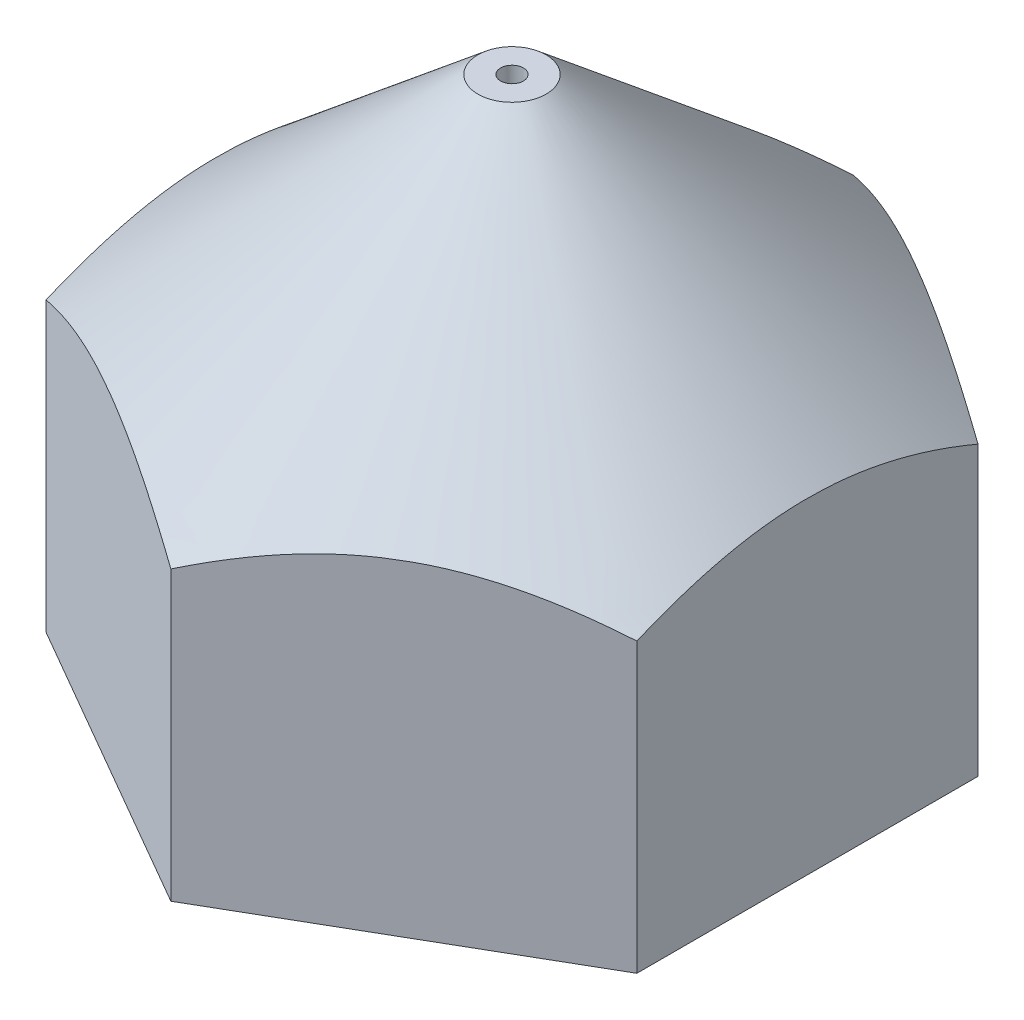
ISO-10303-21;
HEADER;
FILE_DESCRIPTION(('STEP AP214'),'2;1');
FILE_NAME('part.step','',(''),(''),'','','');
FILE_SCHEMA(('AUTOMOTIVE_DESIGN { 1 0 10303 214 1 1 1 1 }'));
ENDSEC;
DATA;
#1=APPLICATION_CONTEXT('core data for automotive mechanical design processes');
#2=APPLICATION_PROTOCOL_DEFINITION('international standard','automotive_design',2000,#1);
#3=PRODUCT_CONTEXT('',#1,'mechanical');
#4=PRODUCT('Part','Part','',(#3));
#5=PRODUCT_RELATED_PRODUCT_CATEGORY('part','',(#4));
#6=PRODUCT_DEFINITION_FORMATION('','',#4);
#7=PRODUCT_DEFINITION_CONTEXT('part definition',#1,'design');
#8=PRODUCT_DEFINITION('design','',#6,#7);
#9=PRODUCT_DEFINITION_SHAPE('','',#8);
#10=(LENGTH_UNIT() NAMED_UNIT(*) SI_UNIT(.MILLI.,.METRE.));
#11=(NAMED_UNIT(*) PLANE_ANGLE_UNIT() SI_UNIT($,.RADIAN.));
#12=(NAMED_UNIT(*) SI_UNIT($,.STERADIAN.) SOLID_ANGLE_UNIT());
#13=UNCERTAINTY_MEASURE_WITH_UNIT(LENGTH_MEASURE(1.E-05),#10,'distance_accuracy_value','');
#14=(GEOMETRIC_REPRESENTATION_CONTEXT(3) GLOBAL_UNCERTAINTY_ASSIGNED_CONTEXT((#13)) GLOBAL_UNIT_ASSIGNED_CONTEXT((#10,
#11,#12)) REPRESENTATION_CONTEXT('',''));
#15=CARTESIAN_POINT('',(0.,0.,0.));
#16=DIRECTION('',(0.,0.,1.));
#17=DIRECTION('',(1.,0.,0.));
#18=AXIS2_PLACEMENT_3D('',#15,#16,#17);
#19=CARTESIAN_POINT('',(6.5,6.,-3.75277674973256));
#20=DIRECTION('',(-0.5,0.,0.866025403784439));
#21=DIRECTION('',(0.866025403784439,0.,0.5));
#22=AXIS2_PLACEMENT_3D('',#19,#20,#21);
#23=PLANE('',#22);
#24=CARTESIAN_POINT('',(6.5002,0.331320657084994,-3.75266127967872));
#25=CARTESIAN_POINT('',(6.28140630257821,0.437269293634635,-3.87898187978218));
#26=CARTESIAN_POINT('',(6.05994197784242,0.536592667607084,-4.00684436728429));
#27=CARTESIAN_POINT('',(5.61105832624123,0.718170563291601,-4.26600746437106));
#28=CARTESIAN_POINT('',(5.38362202146858,0.80036870577893,-4.39731787615504));
#29=CARTESIAN_POINT('',(4.92570762681306,0.942483332184133,-4.66169487517521));
#30=CARTESIAN_POINT('',(4.69527648431638,1.00259702340346,-4.79473435732534));
#31=CARTESIAN_POINT('',(4.2306817676331,1.09738288374467,-5.06296824206651));
#32=CARTESIAN_POINT('',(3.99652310689733,1.13208610162755,-5.19815980787539));
#33=CARTESIAN_POINT('',(3.64193021282832,1.16319795318809,-5.40288411071886));
#34=CARTESIAN_POINT('',(3.52213444765227,1.17004388074785,-5.47204822799103));
#35=CARTESIAN_POINT('',(3.28239122125211,1.17632059579379,-5.61046404428955));
#36=CARTESIAN_POINT('',(3.16244376526932,1.17575163284341,-5.67971574028982));
#37=CARTESIAN_POINT('',(2.92270451447486,1.16719944495742,-5.81812926127133));
#38=CARTESIAN_POINT('',(2.80291279409784,1.15921346411761,-5.88729104327769));
#39=CARTESIAN_POINT('',(2.56384865114642,1.13601868558657,-6.02531479056428));
#40=CARTESIAN_POINT('',(2.4445763036696,1.12080887623102,-6.0941767124869));
#41=CARTESIAN_POINT('',(2.08804197595749,1.06482059665183,-6.30002190256683));
#42=CARTESIAN_POINT('',(1.85196432749452,1.01367932307555,-6.43632139645658));
#43=CARTESIAN_POINT('',(1.38463502573208,0.887648543757464,-6.70613409462932));
#44=CARTESIAN_POINT('',(1.15338547201889,0.812748926447817,-6.83964608671561));
#45=CARTESIAN_POINT('',(0.846386000512093,0.699191564132035,-7.01689231423114));
#46=CARTESIAN_POINT('',(0.768202793522457,0.669016087152231,-7.06203140983271));
#47=CARTESIAN_POINT('',(0.612499676954843,0.606569571062283,-7.15192664609669));
#48=CARTESIAN_POINT('',(0.534979497844023,0.574299434250425,-7.19668294237395));
#49=CARTESIAN_POINT('',(0.38084286951738,0.507936293775513,-7.28567376623031));
#50=CARTESIAN_POINT('',(0.304224188368004,0.473850171695339,-7.32990958241686));
#51=CARTESIAN_POINT('',(0.151570786739018,0.403888173770374,-7.41804406494007));
#52=CARTESIAN_POINT('',(0.0755362790006215,0.36801167854291,-7.46194260845053));
#53=CARTESIAN_POINT('',(-0.000200000000013523,0.331320657084993,-7.50566896951897));
#54=B_SPLINE_CURVE_WITH_KNOTS('',3,(#24,#25,#26,#27,#28,#29,#30,#31,#32,#33,#34,#35,#36,#37,#38,
#39,#40,#41,#42,#43,#44,#45,#46,#47,#48,#49,#50,#51,#52,#53),.UNSPECIFIED.,.F.,.F.,(4,2,2,2,2,2,
2,2,2,2,2,2,2,2,4),(0.,0.822205969643293,1.64707744103592,2.46439292325695,3.2807080630647,
3.69603022493232,4.11133840831134,4.52680096743511,4.94232172736445,5.77302387353115,
6.60408004255696,6.88962944321399,7.17505664622203,7.45947006506786,7.74398256870483),.UNSPECIFIED.);
#55=CARTESIAN_POINT('',(6.5,0.331417550200489,-3.75277674973256));
#56=VERTEX_POINT('',#55);
#57=CARTESIAN_POINT('',(0.,0.331417550200489,-7.50555349946513));
#58=VERTEX_POINT('',#57);
#59=EDGE_CURVE('E85',#56,#58,#54,.T.);
#60=ORIENTED_EDGE('',*,*,#59,.F.);
#61=DIRECTION('',(0.,-1.,0.));
#62=VECTOR('',#61,1.);
#63=CARTESIAN_POINT('',(6.5,6.,-3.75277674973256));
#64=LINE('',#63,#62);
#65=CARTESIAN_POINT('',(6.5,-6.,-3.75277674973256));
#66=VERTEX_POINT('',#65);
#67=EDGE_CURVE('E57',#56,#66,#64,.T.);
#68=ORIENTED_EDGE('',*,*,#67,.T.);
#69=DIRECTION('',(-0.866025403784439,0.,-0.5));
#70=VECTOR('',#69,1.);
#71=CARTESIAN_POINT('',(6.5,-6.,-3.75277674973256));
#72=LINE('',#71,#70);
#73=CARTESIAN_POINT('',(0.,-6.,-7.50555349946513));
#74=VERTEX_POINT('',#73);
#75=EDGE_CURVE('E92',#66,#74,#72,.T.);
#76=ORIENTED_EDGE('',*,*,#75,.T.);
#77=DIRECTION('',(0.,-1.,0.));
#78=VECTOR('',#77,1.);
#79=CARTESIAN_POINT('',(0.,6.,-7.50555349946513));
#80=LINE('',#79,#78);
#81=EDGE_CURVE('E11',#58,#74,#80,.T.);
#82=ORIENTED_EDGE('',*,*,#81,.F.);
#83=EDGE_LOOP('',(#60,#68,#76,#82));
#84=FACE_BOUND('',#83,.T.);
#85=ADVANCED_FACE('F33',(#84),#23,.F.);
#86=CARTESIAN_POINT('',(0.,6.,-7.50555349946513));
#87=DIRECTION('',(0.5,0.,0.866025403784438));
#88=DIRECTION('',(0.866025403784439,0.,-0.5));
#89=AXIS2_PLACEMENT_3D('',#86,#87,#88);
#90=PLANE('',#89);
#91=CARTESIAN_POINT('',(0.000199999999986277,0.331320657084993,-7.50566896951897));
#92=CARTESIAN_POINT('',(-0.218593697421802,0.437269293634631,-7.37934836941551));
#93=CARTESIAN_POINT('',(-0.440058022157595,0.53659266760708,-7.2514858819134));
#94=CARTESIAN_POINT('',(-0.888941673758778,0.718170563291597,-6.99232278482663));
#95=CARTESIAN_POINT('',(-1.11637797853143,0.800368705778926,-6.86101237304265));
#96=CARTESIAN_POINT('',(-1.57429237318695,0.942483332184127,-6.59663537402248));
#97=CARTESIAN_POINT('',(-1.80472351568364,1.00259702340345,-6.46359589187234));
#98=CARTESIAN_POINT('',(-2.26931823236691,1.09738288374466,-6.19536200713118));
#99=CARTESIAN_POINT('',(-2.50347689310268,1.13208610162755,-6.0601704413223));
#100=CARTESIAN_POINT('',(-2.85806978717169,1.16319795318808,-5.85544613847882));
#101=CARTESIAN_POINT('',(-2.97786555234774,1.17004388074784,-5.78628202120666));
#102=CARTESIAN_POINT('',(-3.2176087787479,1.17632059579378,-5.64786620490813));
#103=CARTESIAN_POINT('',(-3.33755623473069,1.1757516328434,-5.57861450890786));
#104=CARTESIAN_POINT('',(-3.57729548552515,1.16719944495741,-5.44020098792636));
#105=CARTESIAN_POINT('',(-3.69708720590217,1.1592134641176,-5.37103920592));
#106=CARTESIAN_POINT('',(-3.93615134885359,1.13601868558656,-5.23301545863341));
#107=CARTESIAN_POINT('',(-4.05542369633041,1.12080887623101,-5.16415353671079));
#108=CARTESIAN_POINT('',(-4.41195802404252,1.06482059665182,-4.95830834663086));
#109=CARTESIAN_POINT('',(-4.64803567250549,1.01367932307554,-4.82200885274111));
#110=CARTESIAN_POINT('',(-5.11536497426793,0.88764854375745,-4.55219615456837));
#111=CARTESIAN_POINT('',(-5.34661452798112,0.812748926447803,-4.41868416248207));
#112=CARTESIAN_POINT('',(-5.65361399948791,0.699191564132021,-4.24143793496655));
#113=CARTESIAN_POINT('',(-5.73179720647755,0.669016087152217,-4.19629883936498));
#114=CARTESIAN_POINT('',(-5.88750032304516,0.606569571062269,-4.10640360310101));
#115=CARTESIAN_POINT('',(-5.96502050215598,0.574299434250412,-4.06164730682375));
#116=CARTESIAN_POINT('',(-6.11915713048262,0.507936293775501,-3.97265648296738));
#117=CARTESIAN_POINT('',(-6.19577581163199,0.473850171695329,-3.92842066678083));
#118=CARTESIAN_POINT('',(-6.34842921326098,0.403888173770366,-3.84028618425763));
#119=CARTESIAN_POINT('',(-6.42446372099937,0.368011678542903,-3.79638764074716));
#120=CARTESIAN_POINT('',(-6.50020000000001,0.331320657084985,-3.75266127967873));
#121=B_SPLINE_CURVE_WITH_KNOTS('',3,(#91,#92,#93,#94,#95,#96,#97,#98,#99,#100,#101,#102,#103,
#104,#105,#106,#107,#108,#109,#110,#111,#112,#113,#114,#115,#116,#117,#118,#119,#120),
.UNSPECIFIED.,.F.,.F.,(4,2,2,2,2,2,2,2,2,2,2,2,2,2,4),(0.,0.822205969643292,1.64707744103592,
2.46439292325695,3.28070806306469,3.69603022493232,4.11133840831134,4.5268009674351,
4.94232172736445,5.77302387353114,6.60408004255695,6.88962944321398,7.17505664622202,
7.45947006506784,7.7439825687048),.UNSPECIFIED.);
#122=CARTESIAN_POINT('',(-6.50000000000001,0.331417550200489,-3.75277674973255));
#123=VERTEX_POINT('',#122);
#124=EDGE_CURVE('E88',#58,#123,#121,.T.);
#125=ORIENTED_EDGE('',*,*,#124,.F.);
#126=ORIENTED_EDGE('',*,*,#81,.T.);
#127=DIRECTION('',(-0.866025403784439,0.,0.5));
#128=VECTOR('',#127,1.);
#129=CARTESIAN_POINT('',(0.,-6.,-7.50555349946513));
#130=LINE('',#129,#128);
#131=CARTESIAN_POINT('',(-6.50000000000001,-6.,-3.75277674973257));
#132=VERTEX_POINT('',#131);
#133=EDGE_CURVE('E104',#74,#132,#130,.T.);
#134=ORIENTED_EDGE('',*,*,#133,.T.);
#135=DIRECTION('',(0.,-1.,0.));
#136=VECTOR('',#135,1.);
#137=CARTESIAN_POINT('',(-6.50000000000001,6.,-3.75277674973257));
#138=LINE('',#137,#136);
#139=EDGE_CURVE('E42',#123,#132,#138,.T.);
#140=ORIENTED_EDGE('',*,*,#139,.F.);
#141=EDGE_LOOP('',(#125,#126,#134,#140));
#142=FACE_BOUND('',#141,.T.);
#143=ADVANCED_FACE('F96',(#142),#90,.F.);
#144=CARTESIAN_POINT('',(-6.50000000000001,6.,-3.75277674973257));
#145=DIRECTION('',(1.,0.,0.));
#146=DIRECTION('',(0.,0.,-1.));
#147=AXIS2_PLACEMENT_3D('',#144,#145,#146);
#148=PLANE('',#147);
#149=CARTESIAN_POINT('',(-6.50000000000001,-1.8205134221234,-7.69138588590504));
#150=CARTESIAN_POINT('',(-6.50000000000001,-1.69267285383202,-7.4918635660892));
#151=CARTESIAN_POINT('',(-6.50000000000001,-1.56625170732981,-7.29141557931619));
#152=CARTESIAN_POINT('',(-6.50000000000001,-1.31690183415457,-6.88829380828733));
#153=CARTESIAN_POINT('',(-6.50000000000001,-1.19397396916951,-6.68561949166684));
#154=CARTESIAN_POINT('',(-6.50000000000001,-0.951481787846135,-6.27634058525399));
#155=CARTESIAN_POINT('',(-6.50000000000001,-0.831947034972371,-6.06971841563172));
#156=CARTESIAN_POINT('',(-6.50000000000001,-0.598085532332962,-5.65355598224154));
#157=CARTESIAN_POINT('',(-6.50000000000001,-0.483758440590684,-5.44401591126967));
#158=CARTESIAN_POINT('',(-6.50000000000001,-0.256870766720181,-5.01282778933708));
#159=CARTESIAN_POINT('',(-6.50000000000001,-0.144579048966412,-4.79103750814606));
#160=CARTESIAN_POINT('',(-6.50000000000001,0.0714325230356011,-4.34326047255116));
#161=CARTESIAN_POINT('',(-6.50000000000001,0.17515130857109,-4.11727319923241));
#162=CARTESIAN_POINT('',(-6.50000000000001,0.371612050774019,-3.66124907627616));
#163=CARTESIAN_POINT('',(-6.50000000000001,0.464382451624991,-3.4312245872774));
#164=CARTESIAN_POINT('',(-6.50000000000001,0.636635056349476,-2.96629585979503));
#165=CARTESIAN_POINT('',(-6.50000000000001,0.716122121971748,-2.73139344219722));
#166=CARTESIAN_POINT('',(-6.50000000000001,0.860602056421721,-2.25072007871624));
#167=CARTESIAN_POINT('',(-6.50000000000001,0.925185421865042,-2.00482411785347));
#168=CARTESIAN_POINT('',(-6.50000000000001,1.03383593332416,-1.50846279340484));
#169=CARTESIAN_POINT('',(-6.50000000000001,1.07790368711325,-1.25799756541159));
#170=CARTESIAN_POINT('',(-6.50000000000001,1.14206167266906,-0.758023565227422));
#171=CARTESIAN_POINT('',(-6.5,1.16252387085642,-0.508563486131926));
#172=CARTESIAN_POINT('',(-6.5,1.17919471237858,-0.008821201167555));
#173=CARTESIAN_POINT('',(-6.5,1.17540432430372,0.241460971469861));
#174=CARTESIAN_POINT('',(-6.5,1.14469324954603,0.727548391153283));
#175=CARTESIAN_POINT('',(-6.5,1.11898010903919,0.963432352274643));
#176=CARTESIAN_POINT('',(-6.5,1.04771231994224,1.4321424315775));
#177=CARTESIAN_POINT('',(-6.5,1.00215633129042,1.66496834214326));
#178=CARTESIAN_POINT('',(-6.5,0.892685351614614,2.13095616527684));
#179=CARTESIAN_POINT('',(-6.5,0.828433245774249,2.36403796486644));
#180=CARTESIAN_POINT('',(-6.5,0.720794850219654,2.7100496817943));
#181=CARTESIAN_POINT('',(-6.5,0.683041092092518,2.82477880887899));
#182=CARTESIAN_POINT('',(-6.5,0.604125819792421,3.05305451329707));
#183=CARTESIAN_POINT('',(-6.5,0.562964467706642,3.16660114658861));
#184=CARTESIAN_POINT('',(-6.5,0.429463084297135,3.51980778040222));
#185=CARTESIAN_POINT('',(-6.5,0.331708654713934,3.75742940032637));
#186=CARTESIAN_POINT('',(-6.5,0.125116472829273,4.22783563111045));
#187=CARTESIAN_POINT('',(-6.5,0.0162749338331895,4.46061855645636));
#188=CARTESIAN_POINT('',(-6.5,-0.210360055092992,4.92213574478891));
#189=CARTESIAN_POINT('',(-6.5,-0.328164896597481,5.15086438436369));
#190=CARTESIAN_POINT('',(-6.5,-0.57081232338037,5.60450470237713));
#191=CARTESIAN_POINT('',(-6.5,-0.695654144537144,5.82941679180452));
#192=CARTESIAN_POINT('',(-6.5,-0.951843294385344,6.27743377274258));
#193=CARTESIAN_POINT('',(-6.5,-1.08322761683254,6.50051743186055));
#194=CARTESIAN_POINT('',(-6.5,-1.35066480713304,6.94386639788338));
#195=CARTESIAN_POINT('',(-6.5,-1.48671777675766,7.16413164320608));
#196=CARTESIAN_POINT('',(-6.5,-1.76255136188309,7.60209798967929));
#197=CARTESIAN_POINT('',(-6.5,-1.90232934173769,7.81980075452581));
#198=CARTESIAN_POINT('',(-6.5,-2.18505033133048,8.25314370553777));
#199=CARTESIAN_POINT('',(-6.5,-2.32799341114257,8.46878384588596));
#200=CARTESIAN_POINT('',(-6.5,-2.72919393759764,9.06604671736743));
#201=CARTESIAN_POINT('',(-6.5,-2.99030930811035,9.44574937412035));
#202=CARTESIAN_POINT('',(-6.5,-3.51874619695136,10.2008880125813));
#203=CARTESIAN_POINT('',(-6.5,-3.78606877854178,10.5763232466504));
#204=CARTESIAN_POINT('',(-6.5,-4.32172347788932,11.3186888251343));
#205=CARTESIAN_POINT('',(-6.5,-4.58999180169642,11.6856652658984));
#206=CARTESIAN_POINT('',(-6.5,-4.9950302402494,12.234102444834));
#207=CARTESIAN_POINT('',(-6.5,-5.13046422929158,12.4165528442246));
#208=CARTESIAN_POINT('',(-6.5,-5.40212825443721,12.7808579337193));
#209=CARTESIAN_POINT('',(-6.5,-5.53835828436392,12.9627126284286));
#210=CARTESIAN_POINT('',(-6.5,-5.67494034862188,13.1443026829529));
#211=B_SPLINE_CURVE_WITH_KNOTS('',3,(#149,#150,#151,#152,#153,#154,#155,#156,#157,#158,#159,
#160,#161,#162,#163,#164,#165,#166,#167,#168,#169,#170,#171,#172,#173,#174,#175,#176,#177,#178,
#179,#180,#181,#182,#183,#184,#185,#186,#187,#188,#189,#190,#191,#192,#193,#194,#195,#196,#197,
#198,#199,#200,#201,#202,#203,#204,#205,#206,#207,#208,#209,#210),.UNSPECIFIED.,.F.,.F.,(4,2,2,
2,2,2,2,2,2,2,2,2,2,2,2,2,2,2,2,2,2,2,2,2,2,2,2,2,2,2,4),(0.,0.710908967485046,1.42199179898245,
2.13805153321099,2.85406417724668,3.59970564286236,4.34543992134921,5.08919199936263,
5.8326712623828,6.59463555955354,7.35657728215844,8.10634119166055,8.85607515757102,
9.56699756745079,10.2779679960238,11.0026496708526,11.3649502040463,11.7272335137771,
12.4976685061028,13.2683675209426,14.0400629358473,14.8116747158021,15.5882992107329,
16.3649406459816,17.1410464375138,17.9171694288972,19.2995371451536,20.682143426401,
22.0458429461921,22.7275117913519,23.4091753542183),.UNSPECIFIED.);
#212=CARTESIAN_POINT('',(-6.49999999999998,0.331417550200489,3.75277674973259));
#213=VERTEX_POINT('',#212);
#214=EDGE_CURVE('E99',#123,#213,#211,.T.);
#215=ORIENTED_EDGE('',*,*,#214,.F.);
#216=ORIENTED_EDGE('',*,*,#139,.T.);
#217=DIRECTION('',(0.,0.,1.));
#218=VECTOR('',#217,1.);
#219=CARTESIAN_POINT('',(-6.50000000000001,-6.,-3.75277674973257));
#220=LINE('',#219,#218);
#221=CARTESIAN_POINT('',(-6.5,-6.,3.75277674973258));
#222=VERTEX_POINT('',#221);
#223=EDGE_CURVE('E106',#132,#222,#220,.T.);
#224=ORIENTED_EDGE('',*,*,#223,.T.);
#225=DIRECTION('',(0.,-1.,0.));
#226=VECTOR('',#225,1.);
#227=CARTESIAN_POINT('',(-6.5,6.,3.75277674973258));
#228=LINE('',#227,#226);
#229=EDGE_CURVE('E128',#213,#222,#228,.T.);
#230=ORIENTED_EDGE('',*,*,#229,.F.);
#231=EDGE_LOOP('',(#215,#216,#224,#230));
#232=FACE_BOUND('',#231,.T.);
#233=ADVANCED_FACE('F131',(#232),#148,.F.);
#234=CARTESIAN_POINT('',(-6.5,6.,3.75277674973258));
#235=DIRECTION('',(0.5,0.,-0.866025403784439));
#236=DIRECTION('',(-0.866025403784439,0.,-0.5));
#237=AXIS2_PLACEMENT_3D('',#234,#235,#236);
#238=PLANE('',#237);
#239=CARTESIAN_POINT('',(-6.5002,0.331320657084984,3.75266127967874));
#240=CARTESIAN_POINT('',(-6.28140630257821,0.437269293634623,3.8789818797822));
#241=CARTESIAN_POINT('',(-6.05994197784242,0.536592667607072,4.00684436728431));
#242=CARTESIAN_POINT('',(-5.61105832624124,0.718170563291589,4.26600746437108));
#243=CARTESIAN_POINT('',(-5.38362202146859,0.800368705778918,4.39731787615506));
#244=CARTESIAN_POINT('',(-4.92570762681306,0.94248333218412,4.66169487517523));
#245=CARTESIAN_POINT('',(-4.69527648431638,1.00259702340345,4.79473435732536));
#246=CARTESIAN_POINT('',(-4.2306817676331,1.09738288374466,5.06296824206653));
#247=CARTESIAN_POINT('',(-3.99652310689733,1.13208610162754,5.19815980787541));
#248=CARTESIAN_POINT('',(-3.64193021282832,1.16319795318807,5.40288411071888));
#249=CARTESIAN_POINT('',(-3.52213444765227,1.17004388074784,5.47204822799105));
#250=CARTESIAN_POINT('',(-3.28239122125211,1.17632059579378,5.61046404428958));
#251=CARTESIAN_POINT('',(-3.16244376526933,1.1757516328434,5.67971574028985));
#252=CARTESIAN_POINT('',(-2.92270451447486,1.16719944495741,5.81812926127135));
#253=CARTESIAN_POINT('',(-2.80291279409784,1.1592134641176,5.88729104327771));
#254=CARTESIAN_POINT('',(-2.56384865114642,1.13601868558656,6.0253147905643));
#255=CARTESIAN_POINT('',(-2.4445763036696,1.12080887623101,6.09417671248692));
#256=CARTESIAN_POINT('',(-2.08804197595749,1.06482059665182,6.30002190256685));
#257=CARTESIAN_POINT('',(-1.85196432749452,1.01367932307553,6.4363213964566));
#258=CARTESIAN_POINT('',(-1.38463502573208,0.887648543757446,6.70613409462934));
#259=CARTESIAN_POINT('',(-1.15338547201889,0.8127489264478,6.83964608671563));
#260=CARTESIAN_POINT('',(-0.846386000512095,0.699191564132018,7.01689231423116));
#261=CARTESIAN_POINT('',(-0.768202793522461,0.669016087152214,7.06203140983273));
#262=CARTESIAN_POINT('',(-0.61249967695485,0.606569571062266,7.1519266460967));
#263=CARTESIAN_POINT('',(-0.534979497844031,0.57429943425041,7.19668294237396));
#264=CARTESIAN_POINT('',(-0.380842869517391,0.5079362937755,7.28567376623033));
#265=CARTESIAN_POINT('',(-0.304224188368017,0.473850171695327,7.32990958241688));
#266=CARTESIAN_POINT('',(-0.151570786739033,0.403888173770364,7.41804406494008));
#267=CARTESIAN_POINT('',(-0.0755362790006383,0.368011678542901,7.46194260845054));
#268=CARTESIAN_POINT('',(0.000199999999994842,0.331320657084984,7.50566896951898));
#269=B_SPLINE_CURVE_WITH_KNOTS('',3,(#239,#240,#241,#242,#243,#244,#245,#246,#247,#248,#249,
#250,#251,#252,#253,#254,#255,#256,#257,#258,#259,#260,#261,#262,#263,#264,#265,#266,#267,#268),
.UNSPECIFIED.,.F.,.F.,(4,2,2,2,2,2,2,2,2,2,2,2,2,2,4),(0.,0.822205969643293,1.64707744103592,
2.46439292325695,3.2807080630647,3.69603022493232,4.11133840831135,4.52680096743511,
4.94232172736445,5.77302387353115,6.60408004255696,6.88962944321398,7.17505664622202,
7.45947006506785,7.74398256870481),.UNSPECIFIED.);
#270=CARTESIAN_POINT('',(0.,0.331417550200489,7.50555349946513));
#271=VERTEX_POINT('',#270);
#272=EDGE_CURVE('E141',#213,#271,#269,.T.);
#273=ORIENTED_EDGE('',*,*,#272,.F.);
#274=ORIENTED_EDGE('',*,*,#229,.T.);
#275=DIRECTION('',(0.866025403784439,0.,0.5));
#276=VECTOR('',#275,1.);
#277=CARTESIAN_POINT('',(-6.5,-6.,3.75277674973258));
#278=LINE('',#277,#276);
#279=CARTESIAN_POINT('',(0.,-6.,7.50555349946514));
#280=VERTEX_POINT('',#279);
#281=EDGE_CURVE('E115',#222,#280,#278,.T.);
#282=ORIENTED_EDGE('',*,*,#281,.T.);
#283=DIRECTION('',(0.,-1.,0.));
#284=VECTOR('',#283,1.);
#285=CARTESIAN_POINT('',(0.,6.,7.50555349946514));
#286=LINE('',#285,#284);
#287=EDGE_CURVE('E126',#271,#280,#286,.T.);
#288=ORIENTED_EDGE('',*,*,#287,.F.);
#289=EDGE_LOOP('',(#273,#274,#282,#288));
#290=FACE_BOUND('',#289,.T.);
#291=ADVANCED_FACE('F140',(#290),#238,.F.);
#292=CARTESIAN_POINT('',(0.,6.,7.50555349946514));
#293=DIRECTION('',(-0.5,0.,-0.866025403784439));
#294=DIRECTION('',(-0.866025403784439,0.,0.5));
#295=AXIS2_PLACEMENT_3D('',#292,#293,#294);
#296=PLANE('',#295);
#297=CARTESIAN_POINT('',(-0.0002000000000057,0.331320657084984,7.50566896951898));
#298=CARTESIAN_POINT('',(0.218593697421782,0.437269293634622,7.37934836941552));
#299=CARTESIAN_POINT('',(0.440058022157576,0.536592667607072,7.25148588191341));
#300=CARTESIAN_POINT('',(0.888941673758761,0.71817056329159,6.99232278482664));
#301=CARTESIAN_POINT('',(1.11637797853141,0.80036870577892,6.86101237304266));
#302=CARTESIAN_POINT('',(1.57429237318694,0.942483332184122,6.59663537402249));
#303=CARTESIAN_POINT('',(1.80472351568362,1.00259702340345,6.46359589187235));
#304=CARTESIAN_POINT('',(2.26931823236689,1.09738288374466,6.19536200713119));
#305=CARTESIAN_POINT('',(2.50347689310266,1.13208610162754,6.06017044132231));
#306=CARTESIAN_POINT('',(2.85806978717168,1.16319795318808,5.85544613847883));
#307=CARTESIAN_POINT('',(2.97786555234773,1.17004388074784,5.78628202120666));
#308=CARTESIAN_POINT('',(3.21760877874789,1.17632059579378,5.64786620490814));
#309=CARTESIAN_POINT('',(3.33755623473067,1.1757516328434,5.57861450890787));
#310=CARTESIAN_POINT('',(3.57729548552514,1.16719944495741,5.44020098792637));
#311=CARTESIAN_POINT('',(3.69708720590216,1.1592134641176,5.37103920592001));
#312=CARTESIAN_POINT('',(3.93615134885358,1.13601868558656,5.23301545863342));
#313=CARTESIAN_POINT('',(4.0554236963304,1.12080887623101,5.16415353671079));
#314=CARTESIAN_POINT('',(4.41195802404251,1.06482059665182,4.95830834663087));
#315=CARTESIAN_POINT('',(4.64803567250548,1.01367932307554,4.82200885274111));
#316=CARTESIAN_POINT('',(5.11536497426792,0.88764854375745,4.55219615456837));
#317=CARTESIAN_POINT('',(5.34661452798111,0.812748926447804,4.41868416248208));
#318=CARTESIAN_POINT('',(5.65361399948791,0.699191564132022,4.24143793496656));
#319=CARTESIAN_POINT('',(5.73179720647754,0.669016087152218,4.19629883936499));
#320=CARTESIAN_POINT('',(5.88750032304515,0.60656957106227,4.10640360310101));
#321=CARTESIAN_POINT('',(5.96502050215597,0.574299434250414,4.06164730682375));
#322=CARTESIAN_POINT('',(6.11915713048261,0.507936293775504,3.97265648296739));
#323=CARTESIAN_POINT('',(6.19577581163199,0.473850171695331,3.92842066678084));
#324=CARTESIAN_POINT('',(6.34842921326097,0.403888173770368,3.84028618425764));
#325=CARTESIAN_POINT('',(6.42446372099937,0.368011678542905,3.79638764074717));
#326=CARTESIAN_POINT('',(6.5002,0.331320657084987,3.75266127967874));
#327=B_SPLINE_CURVE_WITH_KNOTS('',3,(#297,#298,#299,#300,#301,#302,#303,#304,#305,#306,#307,
#308,#309,#310,#311,#312,#313,#314,#315,#316,#317,#318,#319,#320,#321,#322,#323,#324,#325,#326),
.UNSPECIFIED.,.F.,.F.,(4,2,2,2,2,2,2,2,2,2,2,2,2,2,4),(0.,0.822205969643294,1.64707744103592,
2.46439292325695,3.2807080630647,3.69603022493233,4.11133840831135,4.52680096743512,
4.94232172736446,5.77302387353116,6.60408004255697,6.88962944321399,7.17505664622203,
7.45947006506786,7.74398256870482),.UNSPECIFIED.);
#328=CARTESIAN_POINT('',(6.5,0.331417550200484,3.75277674973257));
#329=VERTEX_POINT('',#328);
#330=EDGE_CURVE('E49',#271,#329,#327,.T.);
#331=ORIENTED_EDGE('',*,*,#330,.F.);
#332=ORIENTED_EDGE('',*,*,#287,.T.);
#333=DIRECTION('',(0.866025403784439,0.,-0.5));
#334=VECTOR('',#333,1.);
#335=CARTESIAN_POINT('',(0.,-6.,7.50555349946514));
#336=LINE('',#335,#334);
#337=CARTESIAN_POINT('',(6.5,-6.,3.75277674973257));
#338=VERTEX_POINT('',#337);
#339=EDGE_CURVE('E118',#280,#338,#336,.T.);
#340=ORIENTED_EDGE('',*,*,#339,.T.);
#341=DIRECTION('',(0.,-1.,0.));
#342=VECTOR('',#341,1.);
#343=CARTESIAN_POINT('',(6.5,6.,3.75277674973257));
#344=LINE('',#343,#342);
#345=EDGE_CURVE('E124',#329,#338,#344,.T.);
#346=ORIENTED_EDGE('',*,*,#345,.F.);
#347=EDGE_LOOP('',(#331,#332,#340,#346));
#348=FACE_BOUND('',#347,.T.);
#349=ADVANCED_FACE('F188',(#348),#296,.F.);
#350=CARTESIAN_POINT('',(6.5,6.,3.75277674973257));
#351=DIRECTION('',(-1.,0.,0.));
#352=DIRECTION('',(0.,0.,1.));
#353=AXIS2_PLACEMENT_3D('',#350,#351,#352);
#354=PLANE('',#353);
#355=CARTESIAN_POINT('',(6.5,-1.82051342212338,-7.69138588590502));
#356=CARTESIAN_POINT('',(6.5,-1.692672853832,-7.49186356608918));
#357=CARTESIAN_POINT('',(6.5,-1.56625170732979,-7.29141557931617));
#358=CARTESIAN_POINT('',(6.5,-1.31690183415455,-6.88829380828731));
#359=CARTESIAN_POINT('',(6.5,-1.19397396916949,-6.68561949166682));
#360=CARTESIAN_POINT('',(6.5,-0.951481787846119,-6.27634058525398));
#361=CARTESIAN_POINT('',(6.5,-0.831947034972357,-6.0697184156317));
#362=CARTESIAN_POINT('',(6.5,-0.598085532332949,-5.65355598224152));
#363=CARTESIAN_POINT('',(6.5,-0.483758440590671,-5.44401591126966));
#364=CARTESIAN_POINT('',(6.5,-0.256870766720168,-5.01282778933706));
#365=CARTESIAN_POINT('',(6.5,-0.144579048966399,-4.79103750814605));
#366=CARTESIAN_POINT('',(6.5,0.0714325230356123,-4.34326047255114));
#367=CARTESIAN_POINT('',(6.5,0.175151308571101,-4.11727319923239));
#368=CARTESIAN_POINT('',(6.5,0.371612050774029,-3.66124907627615));
#369=CARTESIAN_POINT('',(6.5,0.464382451625,-3.43122458727739));
#370=CARTESIAN_POINT('',(6.5,0.636635056349485,-2.96629585979502));
#371=CARTESIAN_POINT('',(6.5,0.716122121971755,-2.73139344219721));
#372=CARTESIAN_POINT('',(6.5,0.860602056421728,-2.25072007871623));
#373=CARTESIAN_POINT('',(6.5,0.925185421865049,-2.00482411785347));
#374=CARTESIAN_POINT('',(6.5,1.03383593332417,-1.50846279340483));
#375=CARTESIAN_POINT('',(6.5,1.07790368711326,-1.25799756541159));
#376=CARTESIAN_POINT('',(6.5,1.14206167266907,-0.758023565227419));
#377=CARTESIAN_POINT('',(6.5,1.16252387085642,-0.508563486131924));
#378=CARTESIAN_POINT('',(6.5,1.17919471237858,-0.00882120116755365));
#379=CARTESIAN_POINT('',(6.5,1.17540432430372,0.241460971469862));
#380=CARTESIAN_POINT('',(6.5,1.14469324954603,0.727548391153282));
#381=CARTESIAN_POINT('',(6.5,1.11898010903919,0.963432352274643));
#382=CARTESIAN_POINT('',(6.5,1.04771231994224,1.4321424315775));
#383=CARTESIAN_POINT('',(6.5,1.00215633129043,1.66496834214325));
#384=CARTESIAN_POINT('',(6.5,0.892685351614619,2.13095616527683));
#385=CARTESIAN_POINT('',(6.5,0.828433245774254,2.36403796486644));
#386=CARTESIAN_POINT('',(6.5,0.72079485021966,2.71004968179429));
#387=CARTESIAN_POINT('',(6.5,0.683041092092523,2.82477880887898));
#388=CARTESIAN_POINT('',(6.5,0.604125819792426,3.05305451329707));
#389=CARTESIAN_POINT('',(6.5,0.562964467706647,3.16660114658861));
#390=CARTESIAN_POINT('',(6.5,0.429463084297139,3.51980778040221));
#391=CARTESIAN_POINT('',(6.5,0.331708654713939,3.75742940032637));
#392=CARTESIAN_POINT('',(6.5,0.125116472829278,4.22783563111044));
#393=CARTESIAN_POINT('',(6.5,0.0162749338331939,4.46061855645635));
#394=CARTESIAN_POINT('',(6.5,-0.210360055092987,4.92213574478891));
#395=CARTESIAN_POINT('',(6.5,-0.328164896597475,5.15086438436368));
#396=CARTESIAN_POINT('',(6.5,-0.570812323380364,5.60450470237713));
#397=CARTESIAN_POINT('',(6.5,-0.695654144537139,5.82941679180451));
#398=CARTESIAN_POINT('',(6.5,-0.951843294385339,6.27743377274257));
#399=CARTESIAN_POINT('',(6.5,-1.08322761683253,6.50051743186055));
#400=CARTESIAN_POINT('',(6.5,-1.35066480713303,6.94386639788338));
#401=CARTESIAN_POINT('',(6.5,-1.48671777675766,7.16413164320607));
#402=CARTESIAN_POINT('',(6.5,-1.76255136188309,7.60209798967929));
#403=CARTESIAN_POINT('',(6.5,-1.90232934173769,7.81980075452581));
#404=CARTESIAN_POINT('',(6.5,-2.18505033133047,8.25314370553777));
#405=CARTESIAN_POINT('',(6.5,-2.32799341114257,8.46878384588596));
#406=CARTESIAN_POINT('',(6.5,-2.72919393759763,9.06604671736742));
#407=CARTESIAN_POINT('',(6.5,-2.99030930811035,9.44574937412035));
#408=CARTESIAN_POINT('',(6.5,-3.51874619695135,10.2008880125813));
#409=CARTESIAN_POINT('',(6.5,-3.78606877854178,10.5763232466504));
#410=CARTESIAN_POINT('',(6.5,-4.32172347788931,11.3186888251343));
#411=CARTESIAN_POINT('',(6.5,-4.58999180169642,11.6856652658984));
#412=CARTESIAN_POINT('',(6.5,-4.9950302402494,12.234102444834));
#413=CARTESIAN_POINT('',(6.5,-5.13046422929157,12.4165528442246));
#414=CARTESIAN_POINT('',(6.5,-5.40212825443721,12.7808579337193));
#415=CARTESIAN_POINT('',(6.5,-5.53835828436392,12.9627126284286));
#416=CARTESIAN_POINT('',(6.5,-5.67494034862187,13.1443026829529));
#417=B_SPLINE_CURVE_WITH_KNOTS('',3,(#355,#356,#357,#358,#359,#360,#361,#362,#363,#364,#365,
#366,#367,#368,#369,#370,#371,#372,#373,#374,#375,#376,#377,#378,#379,#380,#381,#382,#383,#384,
#385,#386,#387,#388,#389,#390,#391,#392,#393,#394,#395,#396,#397,#398,#399,#400,#401,#402,#403,
#404,#405,#406,#407,#408,#409,#410,#411,#412,#413,#414,#415,#416),.UNSPECIFIED.,.F.,.F.,(4,2,2,
2,2,2,2,2,2,2,2,2,2,2,2,2,2,2,2,2,2,2,2,2,2,2,2,2,2,2,4),(0.,0.710908967485043,1.42199179898244,
2.13805153321098,2.85406417724667,3.59970564286235,4.34543992134919,5.08919199936261,
5.83267126238278,6.59463555955351,7.35657728215841,8.10634119166052,8.85607515757099,
9.56699756745076,10.2779679960238,11.0026496708526,11.3649502040463,11.727233513777,
12.4976685061028,13.2683675209426,14.0400629358473,14.811674715802,15.5882992107329,
16.3649406459815,17.1410464375137,17.9171694288972,19.2995371451536,20.682143426401,
22.0458429461921,22.7275117913518,23.4091753542183),.UNSPECIFIED.);
#418=EDGE_CURVE('E90',#329,#56,#417,.F.);
#419=ORIENTED_EDGE('',*,*,#418,.F.);
#420=ORIENTED_EDGE('',*,*,#345,.T.);
#421=DIRECTION('',(0.,0.,-1.));
#422=VECTOR('',#421,1.);
#423=CARTESIAN_POINT('',(6.5,-6.,3.75277674973257));
#424=LINE('',#423,#422);
#425=EDGE_CURVE('E121',#338,#66,#424,.T.);
#426=ORIENTED_EDGE('',*,*,#425,.T.);
#427=ORIENTED_EDGE('',*,*,#67,.F.);
#428=EDGE_LOOP('',(#419,#420,#426,#427));
#429=FACE_BOUND('',#428,.T.);
#430=ADVANCED_FACE('F215',(#429),#354,.F.);
#431=CARTESIAN_POINT('',(0.,-6.,-7.50555349946513));
#432=DIRECTION('',(0.,1.,0.));
#433=DIRECTION('',(0.,0.,1.));
#434=AXIS2_PLACEMENT_3D('',#431,#432,#433);
#435=PLANE('',#434);
#436=CARTESIAN_POINT('',(0.,-6.,0.));
#437=DIRECTION('',(0.,1.,0.));
#438=DIRECTION('',(0.,0.,1.));
#439=AXIS2_PLACEMENT_3D('',#436,#437,#438);
#440=CIRCLE('',#439,4.99999999999999);
#441=CARTESIAN_POINT('',(0.,-6.,5.));
#442=VERTEX_POINT('',#441);
#443=EDGE_CURVE('E322',#442,#442,#440,.T.);
#444=ORIENTED_EDGE('',*,*,#443,.T.);
#445=EDGE_LOOP('',(#444));
#446=FACE_BOUND('',#445,.T.);
#447=ORIENTED_EDGE('',*,*,#75,.F.);
#448=ORIENTED_EDGE('',*,*,#425,.F.);
#449=ORIENTED_EDGE('',*,*,#339,.F.);
#450=ORIENTED_EDGE('',*,*,#281,.F.);
#451=ORIENTED_EDGE('',*,*,#223,.F.);
#452=ORIENTED_EDGE('',*,*,#133,.F.);
#453=EDGE_LOOP('',(#447,#448,#449,#450,#451,#452));
#454=FACE_BOUND('',#453,.T.);
#455=ADVANCED_FACE('F135',(#446,#454),#435,.F.);
#456=CARTESIAN_POINT('',(0.,0.331417550200489,0.));
#457=DIRECTION('',(0.,-1.,0.));
#458=DIRECTION('',(0.,0.,-1.));
#459=AXIS2_PLACEMENT_3D('',#456,#457,#458);
#460=CONICAL_SURFACE('',#459,7.50555349946513,0.87266462599717);
#461=CARTESIAN_POINT('',(0.,6.,0.));
#462=DIRECTION('',(0.,-1.,0.));
#463=DIRECTION('',(0.,0.,-1.));
#464=AXIS2_PLACEMENT_3D('',#461,#462,#463);
#465=CIRCLE('',#464,0.75);
#466=CARTESIAN_POINT('',(0.,6.,-0.75));
#467=VERTEX_POINT('',#466);
#468=EDGE_CURVE('E327',#467,#467,#465,.T.);
#469=ORIENTED_EDGE('',*,*,#468,.T.);
#470=EDGE_LOOP('',(#469));
#471=FACE_BOUND('',#470,.T.);
#472=ORIENTED_EDGE('',*,*,#59,.T.);
#473=ORIENTED_EDGE('',*,*,#124,.T.);
#474=ORIENTED_EDGE('',*,*,#214,.T.);
#475=ORIENTED_EDGE('',*,*,#272,.T.);
#476=ORIENTED_EDGE('',*,*,#330,.T.);
#477=ORIENTED_EDGE('',*,*,#418,.T.);
#478=EDGE_LOOP('',(#472,#473,#474,#475,#476,#477));
#479=FACE_BOUND('',#478,.T.);
#480=ADVANCED_FACE('F87',(#471,#479),#460,.T.);
#481=CARTESIAN_POINT('',(0.,6.,-7.50555349946513));
#482=DIRECTION('',(0.,1.,0.));
#483=DIRECTION('',(0.,0.,1.));
#484=AXIS2_PLACEMENT_3D('',#481,#482,#483);
#485=PLANE('',#484);
#486=CARTESIAN_POINT('',(0.,6.,0.));
#487=DIRECTION('',(0.,1.,0.));
#488=DIRECTION('',(0.,0.,1.));
#489=AXIS2_PLACEMENT_3D('',#486,#487,#488);
#490=CIRCLE('',#489,0.25);
#491=CARTESIAN_POINT('',(0.,6.,0.25));
#492=VERTEX_POINT('',#491);
#493=EDGE_CURVE('E325',#492,#492,#490,.T.);
#494=ORIENTED_EDGE('',*,*,#493,.F.);
#495=EDGE_LOOP('',(#494));
#496=FACE_BOUND('',#495,.T.);
#497=ORIENTED_EDGE('',*,*,#468,.F.);
#498=EDGE_LOOP('',(#497));
#499=FACE_BOUND('',#498,.T.);
#500=ADVANCED_FACE('F163',(#496,#499),#485,.T.);
#501=CARTESIAN_POINT('',(0.,-6.,0.));
#502=DIRECTION('',(0.,1.,0.));
#503=DIRECTION('',(0.,0.,1.));
#504=AXIS2_PLACEMENT_3D('',#501,#502,#503);
#505=CYLINDRICAL_SURFACE('',#504,0.25);
#506=CARTESIAN_POINT('',(0.,5.14296299831447,0.));
#507=DIRECTION('',(0.,-1.,0.));
#508=DIRECTION('',(0.,0.,-1.));
#509=AXIS2_PLACEMENT_3D('',#506,#507,#508);
#510=CIRCLE('',#509,0.25);
#511=CARTESIAN_POINT('',(0.,5.14296299831447,-0.25));
#512=VERTEX_POINT('',#511);
#513=EDGE_CURVE('E37',#512,#512,#510,.T.);
#514=ORIENTED_EDGE('',*,*,#513,.T.);
#515=EDGE_LOOP('',(#514));
#516=FACE_BOUND('',#515,.T.);
#517=ORIENTED_EDGE('',*,*,#493,.T.);
#518=EDGE_LOOP('',(#517));
#519=FACE_BOUND('',#518,.T.);
#520=ADVANCED_FACE('F165',(#516,#519),#505,.F.);
#521=CARTESIAN_POINT('',(0.,5.5,0.));
#522=DIRECTION('',(0.,-1.,0.));
#523=DIRECTION('',(0.,0.,-1.));
#524=AXIS2_PLACEMENT_3D('',#521,#522,#523);
#525=CONICAL_SURFACE('',#524,0.,0.610865238198019);
#526=CARTESIAN_POINT('',(0.,3.23281503929692,0.));
#527=DIRECTION('',(0.,1.,0.));
#528=DIRECTION('',(0.,0.,1.));
#529=AXIS2_PLACEMENT_3D('',#526,#527,#528);
#530=CIRCLE('',#529,1.5875);
#531=CARTESIAN_POINT('',(0.,3.23281503929692,-1.5875));
#532=VERTEX_POINT('',#531);
#533=EDGE_CURVE('E312',#532,#532,#530,.T.);
#534=CARTESIAN_POINT('',(0.,3.23281503929692,-1.5875));
#535=CARTESIAN_POINT('',(0.,3.25271241387001,-1.57356770833333));
#536=CARTESIAN_POINT('',(0.,3.27260978844311,-1.55963541666666));
#537=CARTESIAN_POINT('',(0.,3.31240453758931,-1.53177083333333));
#538=CARTESIAN_POINT('',(0.,3.33230191216241,-1.51783854166666));
#539=CARTESIAN_POINT('',(0.,3.37209666130861,-1.48997395833333));
#540=CARTESIAN_POINT('',(0.,3.39199403588171,-1.47604166666666));
#541=CARTESIAN_POINT('',(0.,3.43178878502791,-1.44817708333333));
#542=CARTESIAN_POINT('',(0.,3.45168615960101,-1.43424479166666));
#543=CARTESIAN_POINT('',(0.,3.49148090874721,-1.40638020833333));
#544=CARTESIAN_POINT('',(0.,3.51137828332031,-1.39244791666666));
#545=CARTESIAN_POINT('',(0.,3.55117303246651,-1.36458333333333));
#546=CARTESIAN_POINT('',(0.,3.57107040703961,-1.35065104166666));
#547=CARTESIAN_POINT('',(0.,3.61086515618581,-1.32278645833333));
#548=CARTESIAN_POINT('',(0.,3.63076253075891,-1.30885416666666));
#549=CARTESIAN_POINT('',(0.,3.67055727990511,-1.28098958333333));
#550=CARTESIAN_POINT('',(0.,3.69045465447821,-1.26705729166666));
#551=CARTESIAN_POINT('',(0.,3.7302494036244,-1.23919270833333));
#552=CARTESIAN_POINT('',(0.,3.7501467781975,-1.22526041666666));
#553=CARTESIAN_POINT('',(0.,3.7899415273437,-1.19739583333333));
#554=CARTESIAN_POINT('',(0.,3.8098389019168,-1.18346354166666));
#555=CARTESIAN_POINT('',(0.,3.849633651063,-1.15559895833333));
#556=CARTESIAN_POINT('',(0.,3.8695310256361,-1.14166666666666));
#557=CARTESIAN_POINT('',(0.,3.9093257747823,-1.11380208333333));
#558=CARTESIAN_POINT('',(0.,3.9292231493554,-1.09986979166666));
#559=CARTESIAN_POINT('',(0.,3.9690178985016,-1.07200520833333));
#560=CARTESIAN_POINT('',(0.,3.9889152730747,-1.05807291666666));
#561=CARTESIAN_POINT('',(0.,4.0287100222209,-1.03020833333333));
#562=CARTESIAN_POINT('',(0.,4.048607396794,-1.01627604166666));
#563=CARTESIAN_POINT('',(0.,4.0884021459402,-0.988411458333331));
#564=CARTESIAN_POINT('',(0.,4.1082995205133,-0.974479166666664));
#565=CARTESIAN_POINT('',(0.,4.1480942696595,-0.946614583333331));
#566=CARTESIAN_POINT('',(0.,4.16799164423259,-0.932682291666664));
#567=CARTESIAN_POINT('',(0.,4.20778639337879,-0.904817708333331));
#568=CARTESIAN_POINT('',(0.,4.22768376795189,-0.890885416666664));
#569=CARTESIAN_POINT('',(0.,4.26747851709809,-0.863020833333331));
#570=CARTESIAN_POINT('',(0.,4.28737589167119,-0.849088541666664));
#571=CARTESIAN_POINT('',(0.,4.32717064081739,-0.821223958333331));
#572=CARTESIAN_POINT('',(0.,4.34706801539049,-0.807291666666664));
#573=CARTESIAN_POINT('',(0.,4.38686276453669,-0.779427083333331));
#574=CARTESIAN_POINT('',(0.,4.40676013910979,-0.765494791666664));
#575=CARTESIAN_POINT('',(0.,4.44655488825599,-0.737630208333331));
#576=CARTESIAN_POINT('',(0.,4.46645226282909,-0.723697916666665));
#577=CARTESIAN_POINT('',(0.,4.50624701197529,-0.695833333333332));
#578=CARTESIAN_POINT('',(0.,4.52614438654839,-0.681901041666665));
#579=CARTESIAN_POINT('',(0.,4.56593913569459,-0.654036458333331));
#580=CARTESIAN_POINT('',(0.,4.58583651026769,-0.640104166666665));
#581=CARTESIAN_POINT('',(0.,4.62563125941388,-0.612239583333332));
#582=CARTESIAN_POINT('',(0.,4.64552863398698,-0.598307291666665));
#583=CARTESIAN_POINT('',(0.,4.68532338313318,-0.570442708333332));
#584=CARTESIAN_POINT('',(0.,4.70522075770628,-0.556510416666665));
#585=CARTESIAN_POINT('',(0.,4.74501550685248,-0.528645833333332));
#586=CARTESIAN_POINT('',(0.,4.76491288142558,-0.514713541666665));
#587=CARTESIAN_POINT('',(0.,4.80470763057178,-0.486848958333332));
#588=CARTESIAN_POINT('',(0.,4.82460500514488,-0.472916666666665));
#589=CARTESIAN_POINT('',(0.,4.86439975429108,-0.445052083333332));
#590=CARTESIAN_POINT('',(0.,4.88429712886418,-0.431119791666666));
#591=CARTESIAN_POINT('',(0.,4.92409187801038,-0.403255208333332));
#592=CARTESIAN_POINT('',(0.,4.94398925258348,-0.389322916666666));
#593=CARTESIAN_POINT('',(0.,4.98378400172968,-0.361458333333333));
#594=CARTESIAN_POINT('',(0.,5.00368137630278,-0.347526041666666));
#595=CARTESIAN_POINT('',(0.,5.04347612544898,-0.319661458333333));
#596=CARTESIAN_POINT('',(0.,5.06337350002208,-0.305729166666666));
#597=CARTESIAN_POINT('',(0.,5.10316824916827,-0.277864583333333));
#598=CARTESIAN_POINT('',(0.,5.12306562374137,-0.263932291666666));
#599=CARTESIAN_POINT('',(0.,5.14296299831447,-0.25));
#600=B_SPLINE_CURVE_WITH_KNOTS('',3,(#534,#535,#536,#537,#538,#539,#540,#541,#542,#543,#544,
#545,#546,#547,#548,#549,#550,#551,#552,#553,#554,#555,#556,#557,#558,#559,#560,#561,#562,#563,
#564,#565,#566,#567,#568,#569,#570,#571,#572,#573,#574,#575,#576,#577,#578,#579,#580,#581,#582,
#583,#584,#585,#586,#587,#588,#589,#590,#591,#592,#593,#594,#595,#596,#597,#598,#599),
.UNSPECIFIED.,.F.,.F.,(4,2,2,2,2,2,2,2,2,2,2,2,2,2,2,2,2,2,2,2,2,2,2,2,2,2,2,2,2,2,2,2,4),(0.,
0.0728706277857252,0.14574125557145,0.218611883357175,0.2914825111429,0.364353138928625,
0.43722376671435,0.510094394500075,0.5829650222858,0.655835650071525,0.72870627785725,
0.801576905642975,0.8744475334287,0.947318161214425,1.02018878900015,1.09305941678588,
1.1659300445716,1.23880067235732,1.31167130014305,1.38454192792877,1.4574125557145,
1.53028318350022,1.60315381128595,1.67602443907167,1.7488950668574,1.82176569464312,
1.89463632242885,1.96750695021457,2.0403775780003,2.11324820578602,2.18611883357175,
2.25898946135747,2.3318600891432),.UNSPECIFIED.);
#601=EDGE_CURVE('BSEAM254',#532,#512,#600,.T.);
#602=ORIENTED_EDGE('',*,*,#533,.F.);
#603=ORIENTED_EDGE('',*,*,#513,.F.);
#604=ORIENTED_EDGE('',*,*,#601,.T.);
#605=ORIENTED_EDGE('',*,*,#601,.F.);
#606=EDGE_LOOP('',(#602,#604,#603,#605));
#607=FACE_BOUND('',#606,.T.);
#608=ADVANCED_FACE('F254',(#607),#525,.F.);
#609=CARTESIAN_POINT('',(0.,6.,0.));
#610=DIRECTION('',(0.,1.,0.));
#611=DIRECTION('',(0.,0.,1.));
#612=AXIS2_PLACEMENT_3D('',#609,#610,#611);
#613=CYLINDRICAL_SURFACE('',#612,4.99999999999999);
#614=ORIENTED_EDGE('',*,*,#443,.F.);
#615=EDGE_LOOP('',(#614));
#616=FACE_BOUND('',#615,.T.);
#617=CARTESIAN_POINT('',(0.,0.,0.));
#618=DIRECTION('',(0.,1.,0.));
#619=DIRECTION('',(0.,0.,1.));
#620=AXIS2_PLACEMENT_3D('',#617,#618,#619);
#621=CIRCLE('',#620,4.99999999999999);
#622=CARTESIAN_POINT('',(0.,0.,5.));
#623=VERTEX_POINT('',#622);
#624=EDGE_CURVE('E319',#623,#623,#621,.T.);
#625=ORIENTED_EDGE('',*,*,#624,.T.);
#626=EDGE_LOOP('',(#625));
#627=FACE_BOUND('',#626,.T.);
#628=ADVANCED_FACE('F263',(#616,#627),#613,.F.);
#629=CARTESIAN_POINT('',(0.,0.,5.));
#630=DIRECTION('',(0.,1.,0.));
#631=DIRECTION('',(0.,0.,1.));
#632=AXIS2_PLACEMENT_3D('',#629,#630,#631);
#633=PLANE('',#632);
#634=ORIENTED_EDGE('',*,*,#624,.F.);
#635=EDGE_LOOP('',(#634));
#636=FACE_BOUND('',#635,.T.);
#637=CARTESIAN_POINT('',(0.,0.,0.));
#638=DIRECTION('',(0.,1.,0.));
#639=DIRECTION('',(0.,0.,1.));
#640=AXIS2_PLACEMENT_3D('',#637,#638,#639);
#641=CIRCLE('',#640,1.83749999999999);
#642=CARTESIAN_POINT('',(0.,0.,1.8375));
#643=VERTEX_POINT('',#642);
#644=EDGE_CURVE('E314',#643,#643,#641,.T.);
#645=ORIENTED_EDGE('',*,*,#644,.T.);
#646=EDGE_LOOP('',(#645));
#647=FACE_BOUND('',#646,.T.);
#648=ADVANCED_FACE('F273',(#636,#647),#633,.F.);
#649=CARTESIAN_POINT('',(0.,0.249999999999999,0.));
#650=DIRECTION('',(0.,-1.,0.));
#651=DIRECTION('',(0.,0.,-1.));
#652=AXIS2_PLACEMENT_3D('',#649,#650,#651);
#653=CONICAL_SURFACE('',#652,1.5875,0.785398163397444);
#654=ORIENTED_EDGE('',*,*,#644,.F.);
#655=EDGE_LOOP('',(#654));
#656=FACE_BOUND('',#655,.T.);
#657=CARTESIAN_POINT('',(0.,0.249999999999999,0.));
#658=DIRECTION('',(0.,1.,0.));
#659=DIRECTION('',(0.,0.,1.));
#660=AXIS2_PLACEMENT_3D('',#657,#658,#659);
#661=CIRCLE('',#660,1.5875);
#662=CARTESIAN_POINT('',(0.,0.25,1.5875));
#663=VERTEX_POINT('',#662);
#664=EDGE_CURVE('E309',#663,#663,#661,.T.);
#665=ORIENTED_EDGE('',*,*,#664,.T.);
#666=EDGE_LOOP('',(#665));
#667=FACE_BOUND('',#666,.T.);
#668=ADVANCED_FACE('F282',(#656,#667),#653,.F.);
#669=CARTESIAN_POINT('',(0.,6.,0.));
#670=DIRECTION('',(0.,1.,0.));
#671=DIRECTION('',(0.,0.,1.));
#672=AXIS2_PLACEMENT_3D('',#669,#670,#671);
#673=CYLINDRICAL_SURFACE('',#672,1.5875);
#674=ORIENTED_EDGE('',*,*,#664,.F.);
#675=EDGE_LOOP('',(#674));
#676=FACE_BOUND('',#675,.T.);
#677=ORIENTED_EDGE('',*,*,#533,.T.);
#678=EDGE_LOOP('',(#677));
#679=FACE_BOUND('',#678,.T.);
#680=ADVANCED_FACE('F292',(#676,#679),#673,.F.);
#681=CLOSED_SHELL('',(#85,#143,#233,#291,#349,#430,#455,#480,#500,#520,#608,#628,#648,#668,#680));
#682=MANIFOLD_SOLID_BREP('B2',#681);
#683=ADVANCED_BREP_SHAPE_REPRESENTATION('',(#18,#682),#14);
#684=SHAPE_DEFINITION_REPRESENTATION(#9,#683);
ENDSEC;
END-ISO-10303-21;
